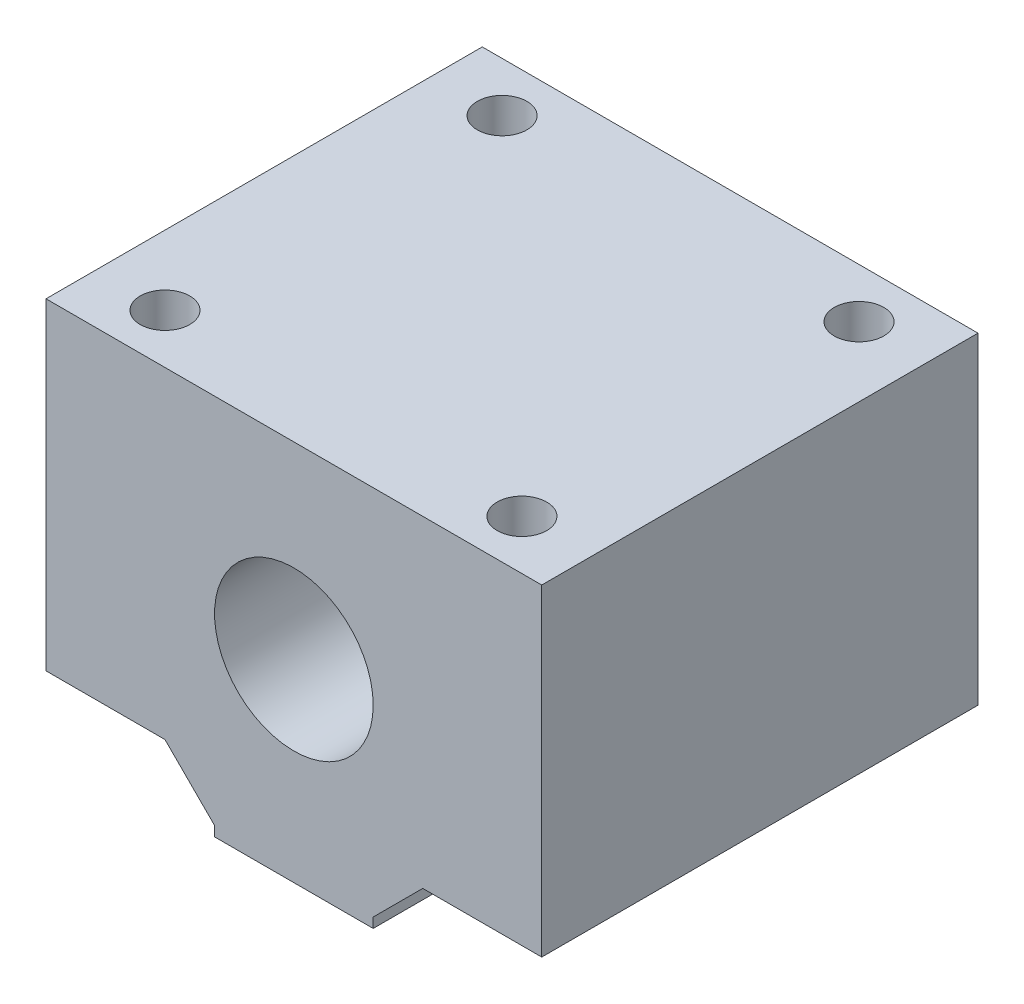
ISO-10303-21;
HEADER;
FILE_DESCRIPTION(('STEP AP214'),'2;1');
FILE_NAME('part.step','',(''),(''),'','','');
FILE_SCHEMA(('AUTOMOTIVE_DESIGN { 1 0 10303 214 1 1 1 1 }'));
ENDSEC;
DATA;
#1=APPLICATION_CONTEXT('core data for automotive mechanical design processes');
#2=APPLICATION_PROTOCOL_DEFINITION('international standard','automotive_design',2000,#1);
#3=PRODUCT_CONTEXT('',#1,'mechanical');
#4=PRODUCT('Part','Part','',(#3));
#5=PRODUCT_RELATED_PRODUCT_CATEGORY('part','',(#4));
#6=PRODUCT_DEFINITION_FORMATION('','',#4);
#7=PRODUCT_DEFINITION_CONTEXT('part definition',#1,'design');
#8=PRODUCT_DEFINITION('design','',#6,#7);
#9=PRODUCT_DEFINITION_SHAPE('','',#8);
#10=(LENGTH_UNIT() NAMED_UNIT(*) SI_UNIT(.MILLI.,.METRE.));
#11=(NAMED_UNIT(*) PLANE_ANGLE_UNIT() SI_UNIT($,.RADIAN.));
#12=(NAMED_UNIT(*) SI_UNIT($,.STERADIAN.) SOLID_ANGLE_UNIT());
#13=UNCERTAINTY_MEASURE_WITH_UNIT(LENGTH_MEASURE(1.E-05),#10,'distance_accuracy_value','');
#14=(GEOMETRIC_REPRESENTATION_CONTEXT(3) GLOBAL_UNCERTAINTY_ASSIGNED_CONTEXT((#13)) GLOBAL_UNIT_ASSIGNED_CONTEXT((#10,
#11,#12)) REPRESENTATION_CONTEXT('',''));
#15=CARTESIAN_POINT('',(0.,0.,0.));
#16=DIRECTION('',(0.,0.,1.));
#17=DIRECTION('',(1.,0.,0.));
#18=AXIS2_PLACEMENT_3D('',#15,#16,#17);
#19=CARTESIAN_POINT('',(-8.,5.99999999999999,44.));
#20=DIRECTION('',(0.,0.,1.));
#21=DIRECTION('',(1.,0.,0.));
#22=AXIS2_PLACEMENT_3D('',#19,#20,#21);
#23=PLANE('',#22);
#24=DIRECTION('',(0.,-1.,0.));
#25=VECTOR('',#24,1.);
#26=CARTESIAN_POINT('',(-8.,0.,44.));
#27=LINE('',#26,#25);
#28=CARTESIAN_POINT('',(-8.,0.999999999999986,44.));
#29=VERTEX_POINT('',#28);
#30=CARTESIAN_POINT('',(-8.,0.,44.));
#31=VERTEX_POINT('',#30);
#32=EDGE_CURVE('E163',#29,#31,#27,.T.);
#33=ORIENTED_EDGE('',*,*,#32,.T.);
#34=DIRECTION('',(1.,0.,0.));
#35=VECTOR('',#34,1.);
#36=CARTESIAN_POINT('',(8.,0.,44.));
#37=LINE('',#36,#35);
#38=CARTESIAN_POINT('',(8.,0.,44.));
#39=VERTEX_POINT('',#38);
#40=EDGE_CURVE('E101',#31,#39,#37,.T.);
#41=ORIENTED_EDGE('',*,*,#40,.T.);
#42=DIRECTION('',(0.,1.,0.));
#43=VECTOR('',#42,1.);
#44=CARTESIAN_POINT('',(8.,0.,44.));
#45=LINE('',#44,#43);
#46=CARTESIAN_POINT('',(8.,0.999999999999986,44.));
#47=VERTEX_POINT('',#46);
#48=EDGE_CURVE('E202',#39,#47,#45,.T.);
#49=ORIENTED_EDGE('',*,*,#48,.T.);
#50=DIRECTION('',(0.707106781186548,0.707106781186547,0.));
#51=VECTOR('',#50,1.);
#52=CARTESIAN_POINT('',(8.,0.999999999999986,44.));
#53=LINE('',#52,#51);
#54=CARTESIAN_POINT('',(13.,5.99999999999999,44.));
#55=VERTEX_POINT('',#54);
#56=EDGE_CURVE('E204',#47,#55,#53,.T.);
#57=ORIENTED_EDGE('',*,*,#56,.T.);
#58=DIRECTION('',(1.,0.,0.));
#59=VECTOR('',#58,1.);
#60=CARTESIAN_POINT('',(13.,5.99999999999999,44.));
#61=LINE('',#60,#59);
#62=CARTESIAN_POINT('',(25.,5.99999999999998,44.));
#63=VERTEX_POINT('',#62);
#64=EDGE_CURVE('E206',#55,#63,#61,.T.);
#65=ORIENTED_EDGE('',*,*,#64,.T.);
#66=DIRECTION('',(0.,1.,0.));
#67=VECTOR('',#66,1.);
#68=CARTESIAN_POINT('',(25.,5.99999999999998,44.));
#69=LINE('',#68,#67);
#70=CARTESIAN_POINT('',(25.,38.5,44.));
#71=VERTEX_POINT('',#70);
#72=EDGE_CURVE('E208',#63,#71,#69,.T.);
#73=ORIENTED_EDGE('',*,*,#72,.T.);
#74=DIRECTION('',(-1.,0.,0.));
#75=VECTOR('',#74,1.);
#76=CARTESIAN_POINT('',(-25.,38.5,44.));
#77=LINE('',#76,#75);
#78=CARTESIAN_POINT('',(-25.,38.5,44.));
#79=VERTEX_POINT('',#78);
#80=EDGE_CURVE('E126',#71,#79,#77,.T.);
#81=ORIENTED_EDGE('',*,*,#80,.T.);
#82=DIRECTION('',(0.,-1.,0.));
#83=VECTOR('',#82,1.);
#84=CARTESIAN_POINT('',(-25.,5.99999999999998,44.));
#85=LINE('',#84,#83);
#86=CARTESIAN_POINT('',(-25.,5.99999999999998,44.));
#87=VERTEX_POINT('',#86);
#88=EDGE_CURVE('E120',#79,#87,#85,.T.);
#89=ORIENTED_EDGE('',*,*,#88,.T.);
#90=DIRECTION('',(1.,0.,0.));
#91=VECTOR('',#90,1.);
#92=CARTESIAN_POINT('',(-13.,5.99999999999999,44.));
#93=LINE('',#92,#91);
#94=CARTESIAN_POINT('',(-13.,5.99999999999999,44.));
#95=VERTEX_POINT('',#94);
#96=EDGE_CURVE('E124',#87,#95,#93,.T.);
#97=ORIENTED_EDGE('',*,*,#96,.T.);
#98=DIRECTION('',(0.707106781186548,-0.707106781186547,0.));
#99=VECTOR('',#98,1.);
#100=CARTESIAN_POINT('',(-8.,0.999999999999986,44.));
#101=LINE('',#100,#99);
#102=EDGE_CURVE('E52',#95,#29,#101,.T.);
#103=ORIENTED_EDGE('',*,*,#102,.T.);
#104=EDGE_LOOP('',(#33,#41,#49,#57,#65,#73,#81,#89,#97,#103));
#105=FACE_BOUND('',#104,.T.);
#106=CARTESIAN_POINT('',(0.,19.5,44.));
#107=DIRECTION('',(0.,0.,1.));
#108=DIRECTION('',(1.,0.,0.));
#109=AXIS2_PLACEMENT_3D('',#106,#107,#108);
#110=CIRCLE('',#109,8.);
#111=CARTESIAN_POINT('',(8.,19.5,44.));
#112=VERTEX_POINT('',#111);
#113=EDGE_CURVE('E148',#112,#112,#110,.T.);
#114=ORIENTED_EDGE('',*,*,#113,.F.);
#115=EDGE_LOOP('',(#114));
#116=FACE_BOUND('',#115,.T.);
#117=ADVANCED_FACE('F33',(#105,#116),#23,.T.);
#118=CARTESIAN_POINT('',(-8.,5.99999999999999,0.));
#119=DIRECTION('',(0.,0.,1.));
#120=DIRECTION('',(1.,0.,0.));
#121=AXIS2_PLACEMENT_3D('',#118,#119,#120);
#122=PLANE('',#121);
#123=DIRECTION('',(0.,-1.,0.));
#124=VECTOR('',#123,1.);
#125=CARTESIAN_POINT('',(-8.,0.,0.));
#126=LINE('',#125,#124);
#127=CARTESIAN_POINT('',(-8.,0.999999999999986,0.));
#128=VERTEX_POINT('',#127);
#129=CARTESIAN_POINT('',(-8.,0.,0.));
#130=VERTEX_POINT('',#129);
#131=EDGE_CURVE('E144',#128,#130,#126,.T.);
#132=ORIENTED_EDGE('',*,*,#131,.F.);
#133=DIRECTION('',(0.707106781186548,-0.707106781186547,0.));
#134=VECTOR('',#133,1.);
#135=CARTESIAN_POINT('',(-8.,0.999999999999986,0.));
#136=LINE('',#135,#134);
#137=CARTESIAN_POINT('',(-13.,5.99999999999999,0.));
#138=VERTEX_POINT('',#137);
#139=EDGE_CURVE('E93',#138,#128,#136,.T.);
#140=ORIENTED_EDGE('',*,*,#139,.F.);
#141=DIRECTION('',(1.,0.,0.));
#142=VECTOR('',#141,1.);
#143=CARTESIAN_POINT('',(-13.,5.99999999999999,0.));
#144=LINE('',#143,#142);
#145=CARTESIAN_POINT('',(-25.,5.99999999999998,0.));
#146=VERTEX_POINT('',#145);
#147=EDGE_CURVE('E87',#146,#138,#144,.T.);
#148=ORIENTED_EDGE('',*,*,#147,.F.);
#149=DIRECTION('',(0.,-1.,0.));
#150=VECTOR('',#149,1.);
#151=CARTESIAN_POINT('',(-25.,5.99999999999998,0.));
#152=LINE('',#151,#150);
#153=CARTESIAN_POINT('',(-25.,38.5,0.));
#154=VERTEX_POINT('',#153);
#155=EDGE_CURVE('E134',#154,#146,#152,.T.);
#156=ORIENTED_EDGE('',*,*,#155,.F.);
#157=DIRECTION('',(-1.,0.,0.));
#158=VECTOR('',#157,1.);
#159=CARTESIAN_POINT('',(-25.,38.5,0.));
#160=LINE('',#159,#158);
#161=CARTESIAN_POINT('',(25.,38.5,0.));
#162=VERTEX_POINT('',#161);
#163=EDGE_CURVE('E158',#162,#154,#160,.T.);
#164=ORIENTED_EDGE('',*,*,#163,.F.);
#165=DIRECTION('',(0.,1.,0.));
#166=VECTOR('',#165,1.);
#167=CARTESIAN_POINT('',(25.,5.99999999999998,0.));
#168=LINE('',#167,#166);
#169=CARTESIAN_POINT('',(25.,5.99999999999998,0.));
#170=VERTEX_POINT('',#169);
#171=EDGE_CURVE('E156',#170,#162,#168,.T.);
#172=ORIENTED_EDGE('',*,*,#171,.F.);
#173=DIRECTION('',(1.,0.,0.));
#174=VECTOR('',#173,1.);
#175=CARTESIAN_POINT('',(13.,5.99999999999999,0.));
#176=LINE('',#175,#174);
#177=CARTESIAN_POINT('',(13.,5.99999999999999,0.));
#178=VERTEX_POINT('',#177);
#179=EDGE_CURVE('E154',#178,#170,#176,.T.);
#180=ORIENTED_EDGE('',*,*,#179,.F.);
#181=DIRECTION('',(0.707106781186548,0.707106781186547,0.));
#182=VECTOR('',#181,1.);
#183=CARTESIAN_POINT('',(8.,0.999999999999986,0.));
#184=LINE('',#183,#182);
#185=CARTESIAN_POINT('',(8.,0.999999999999986,0.));
#186=VERTEX_POINT('',#185);
#187=EDGE_CURVE('E152',#186,#178,#184,.T.);
#188=ORIENTED_EDGE('',*,*,#187,.F.);
#189=DIRECTION('',(0.,1.,0.));
#190=VECTOR('',#189,1.);
#191=CARTESIAN_POINT('',(8.,0.,0.));
#192=LINE('',#191,#190);
#193=CARTESIAN_POINT('',(8.,0.,0.));
#194=VERTEX_POINT('',#193);
#195=EDGE_CURVE('E150',#194,#186,#192,.T.);
#196=ORIENTED_EDGE('',*,*,#195,.F.);
#197=DIRECTION('',(1.,0.,0.));
#198=VECTOR('',#197,1.);
#199=CARTESIAN_POINT('',(8.,0.,0.));
#200=LINE('',#199,#198);
#201=EDGE_CURVE('E147',#130,#194,#200,.T.);
#202=ORIENTED_EDGE('',*,*,#201,.F.);
#203=EDGE_LOOP('',(#132,#140,#148,#156,#164,#172,#180,#188,#196,#202));
#204=FACE_BOUND('',#203,.T.);
#205=CARTESIAN_POINT('',(0.,19.5,0.));
#206=DIRECTION('',(0.,0.,1.));
#207=DIRECTION('',(1.,0.,0.));
#208=AXIS2_PLACEMENT_3D('',#205,#206,#207);
#209=CIRCLE('',#208,8.);
#210=CARTESIAN_POINT('',(8.,19.5,0.));
#211=VERTEX_POINT('',#210);
#212=EDGE_CURVE('E182',#211,#211,#209,.T.);
#213=ORIENTED_EDGE('',*,*,#212,.T.);
#214=EDGE_LOOP('',(#213));
#215=FACE_BOUND('',#214,.T.);
#216=ADVANCED_FACE('F221',(#204,#215),#122,.F.);
#217=CARTESIAN_POINT('',(-8.,0.,44.));
#218=DIRECTION('',(1.,0.,0.));
#219=DIRECTION('',(0.,0.,-1.));
#220=AXIS2_PLACEMENT_3D('',#217,#218,#219);
#221=PLANE('',#220);
#222=ORIENTED_EDGE('',*,*,#131,.T.);
#223=DIRECTION('',(0.,0.,-1.));
#224=VECTOR('',#223,1.);
#225=CARTESIAN_POINT('',(-8.,0.,44.));
#226=LINE('',#225,#224);
#227=EDGE_CURVE('E11',#31,#130,#226,.T.);
#228=ORIENTED_EDGE('',*,*,#227,.F.);
#229=ORIENTED_EDGE('',*,*,#32,.F.);
#230=DIRECTION('',(0.,0.,-1.));
#231=VECTOR('',#230,1.);
#232=CARTESIAN_POINT('',(-8.,0.999999999999986,44.));
#233=LINE('',#232,#231);
#234=EDGE_CURVE('E140',#29,#128,#233,.T.);
#235=ORIENTED_EDGE('',*,*,#234,.T.);
#236=EDGE_LOOP('',(#222,#228,#229,#235));
#237=FACE_BOUND('',#236,.T.);
#238=ADVANCED_FACE('F35',(#237),#221,.F.);
#239=CARTESIAN_POINT('',(8.,0.,44.));
#240=DIRECTION('',(0.,1.,0.));
#241=DIRECTION('',(0.,0.,1.));
#242=AXIS2_PLACEMENT_3D('',#239,#240,#241);
#243=PLANE('',#242);
#244=ORIENTED_EDGE('',*,*,#201,.T.);
#245=DIRECTION('',(0.,0.,-1.));
#246=VECTOR('',#245,1.);
#247=CARTESIAN_POINT('',(8.,0.,44.));
#248=LINE('',#247,#246);
#249=EDGE_CURVE('E43',#39,#194,#248,.T.);
#250=ORIENTED_EDGE('',*,*,#249,.F.);
#251=ORIENTED_EDGE('',*,*,#40,.F.);
#252=ORIENTED_EDGE('',*,*,#227,.T.);
#253=EDGE_LOOP('',(#244,#250,#251,#252));
#254=FACE_BOUND('',#253,.T.);
#255=ADVANCED_FACE('F301',(#254),#243,.F.);
#256=CARTESIAN_POINT('',(8.,0.,44.));
#257=DIRECTION('',(-1.,0.,0.));
#258=DIRECTION('',(0.,0.,1.));
#259=AXIS2_PLACEMENT_3D('',#256,#257,#258);
#260=PLANE('',#259);
#261=ORIENTED_EDGE('',*,*,#195,.T.);
#262=DIRECTION('',(0.,0.,-1.));
#263=VECTOR('',#262,1.);
#264=CARTESIAN_POINT('',(8.,0.999999999999986,44.));
#265=LINE('',#264,#263);
#266=EDGE_CURVE('E176',#47,#186,#265,.T.);
#267=ORIENTED_EDGE('',*,*,#266,.F.);
#268=ORIENTED_EDGE('',*,*,#48,.F.);
#269=ORIENTED_EDGE('',*,*,#249,.T.);
#270=EDGE_LOOP('',(#261,#267,#268,#269));
#271=FACE_BOUND('',#270,.T.);
#272=ADVANCED_FACE('F298',(#271),#260,.F.);
#273=CARTESIAN_POINT('',(8.,0.999999999999986,44.));
#274=DIRECTION('',(-0.707106781186547,0.707106781186548,0.));
#275=DIRECTION('',(-0.707106781186548,-0.707106781186547,0.));
#276=AXIS2_PLACEMENT_3D('',#273,#274,#275);
#277=PLANE('',#276);
#278=ORIENTED_EDGE('',*,*,#187,.T.);
#279=DIRECTION('',(0.,0.,-1.));
#280=VECTOR('',#279,1.);
#281=CARTESIAN_POINT('',(13.,5.99999999999999,44.));
#282=LINE('',#281,#280);
#283=EDGE_CURVE('E173',#55,#178,#282,.T.);
#284=ORIENTED_EDGE('',*,*,#283,.F.);
#285=ORIENTED_EDGE('',*,*,#56,.F.);
#286=ORIENTED_EDGE('',*,*,#266,.T.);
#287=EDGE_LOOP('',(#278,#284,#285,#286));
#288=FACE_BOUND('',#287,.T.);
#289=ADVANCED_FACE('F294',(#288),#277,.F.);
#290=CARTESIAN_POINT('',(13.,5.99999999999999,44.));
#291=DIRECTION('',(0.,1.,0.));
#292=DIRECTION('',(-1.,0.,0.));
#293=AXIS2_PLACEMENT_3D('',#290,#291,#292);
#294=PLANE('',#293);
#295=CARTESIAN_POINT('',(18.,5.99999999999999,39.));
#296=DIRECTION('',(0.,1.,0.));
#297=DIRECTION('',(-1.,0.,0.));
#298=AXIS2_PLACEMENT_3D('',#295,#296,#297);
#299=CIRCLE('',#298,2.5);
#300=CARTESIAN_POINT('',(18.,5.99999999999999,41.5));
#301=VERTEX_POINT('',#300);
#302=EDGE_CURVE('E270',#301,#301,#299,.T.);
#303=ORIENTED_EDGE('',*,*,#302,.T.);
#304=EDGE_LOOP('',(#303));
#305=FACE_BOUND('',#304,.T.);
#306=CARTESIAN_POINT('',(18.,5.99999999999999,5.));
#307=DIRECTION('',(0.,1.,0.));
#308=DIRECTION('',(-1.,0.,0.));
#309=AXIS2_PLACEMENT_3D('',#306,#307,#308);
#310=CIRCLE('',#309,2.5);
#311=CARTESIAN_POINT('',(18.,5.99999999999999,7.49999999999999));
#312=VERTEX_POINT('',#311);
#313=EDGE_CURVE('E189',#312,#312,#310,.T.);
#314=ORIENTED_EDGE('',*,*,#313,.T.);
#315=EDGE_LOOP('',(#314));
#316=FACE_BOUND('',#315,.T.);
#317=ORIENTED_EDGE('',*,*,#179,.T.);
#318=DIRECTION('',(0.,0.,-1.));
#319=VECTOR('',#318,1.);
#320=CARTESIAN_POINT('',(25.,5.99999999999998,44.));
#321=LINE('',#320,#319);
#322=EDGE_CURVE('E170',#63,#170,#321,.T.);
#323=ORIENTED_EDGE('',*,*,#322,.F.);
#324=ORIENTED_EDGE('',*,*,#64,.F.);
#325=ORIENTED_EDGE('',*,*,#283,.T.);
#326=EDGE_LOOP('',(#317,#323,#324,#325));
#327=FACE_BOUND('',#326,.T.);
#328=ADVANCED_FACE('F288',(#305,#316,#327),#294,.F.);
#329=CARTESIAN_POINT('',(25.,5.99999999999998,44.));
#330=DIRECTION('',(-1.,0.,0.));
#331=DIRECTION('',(0.,0.,1.));
#332=AXIS2_PLACEMENT_3D('',#329,#330,#331);
#333=PLANE('',#332);
#334=ORIENTED_EDGE('',*,*,#171,.T.);
#335=DIRECTION('',(0.,0.,-1.));
#336=VECTOR('',#335,1.);
#337=CARTESIAN_POINT('',(25.,38.5,44.));
#338=LINE('',#337,#336);
#339=EDGE_CURVE('E167',#71,#162,#338,.T.);
#340=ORIENTED_EDGE('',*,*,#339,.F.);
#341=ORIENTED_EDGE('',*,*,#72,.F.);
#342=ORIENTED_EDGE('',*,*,#322,.T.);
#343=EDGE_LOOP('',(#334,#340,#341,#342));
#344=FACE_BOUND('',#343,.T.);
#345=ADVANCED_FACE('F214',(#344),#333,.F.);
#346=CARTESIAN_POINT('',(-25.,38.5,44.));
#347=DIRECTION('',(0.,-1.,0.));
#348=DIRECTION('',(0.,0.,-1.));
#349=AXIS2_PLACEMENT_3D('',#346,#347,#348);
#350=PLANE('',#349);
#351=CARTESIAN_POINT('',(-18.,38.5,39.));
#352=DIRECTION('',(0.,1.,0.));
#353=DIRECTION('',(0.,0.,-1.));
#354=AXIS2_PLACEMENT_3D('',#351,#352,#353);
#355=CIRCLE('',#354,2.5);
#356=CARTESIAN_POINT('',(-18.,38.5,41.5));
#357=VERTEX_POINT('',#356);
#358=EDGE_CURVE('E265',#357,#357,#355,.T.);
#359=ORIENTED_EDGE('',*,*,#358,.F.);
#360=EDGE_LOOP('',(#359));
#361=FACE_BOUND('',#360,.T.);
#362=CARTESIAN_POINT('',(18.,38.5,39.));
#363=DIRECTION('',(0.,1.,0.));
#364=DIRECTION('',(0.,0.,1.));
#365=AXIS2_PLACEMENT_3D('',#362,#363,#364);
#366=CIRCLE('',#365,2.5);
#367=CARTESIAN_POINT('',(18.,38.5,41.5));
#368=VERTEX_POINT('',#367);
#369=EDGE_CURVE('E268',#368,#368,#366,.T.);
#370=ORIENTED_EDGE('',*,*,#369,.F.);
#371=EDGE_LOOP('',(#370));
#372=FACE_BOUND('',#371,.T.);
#373=CARTESIAN_POINT('',(18.,38.5,5.));
#374=DIRECTION('',(0.,1.,0.));
#375=DIRECTION('',(0.,0.,-1.));
#376=AXIS2_PLACEMENT_3D('',#373,#374,#375);
#377=CIRCLE('',#376,2.5);
#378=CARTESIAN_POINT('',(18.,38.5,7.49999999999999));
#379=VERTEX_POINT('',#378);
#380=EDGE_CURVE('E194',#379,#379,#377,.T.);
#381=ORIENTED_EDGE('',*,*,#380,.F.);
#382=EDGE_LOOP('',(#381));
#383=FACE_BOUND('',#382,.T.);
#384=CARTESIAN_POINT('',(-18.,38.5,5.));
#385=DIRECTION('',(0.,1.,0.));
#386=DIRECTION('',(0.,0.,1.));
#387=AXIS2_PLACEMENT_3D('',#384,#385,#386);
#388=CIRCLE('',#387,2.5);
#389=CARTESIAN_POINT('',(-18.,38.5,7.5));
#390=VERTEX_POINT('',#389);
#391=EDGE_CURVE('E183',#390,#390,#388,.T.);
#392=ORIENTED_EDGE('',*,*,#391,.F.);
#393=EDGE_LOOP('',(#392));
#394=FACE_BOUND('',#393,.T.);
#395=ORIENTED_EDGE('',*,*,#163,.T.);
#396=DIRECTION('',(0.,0.,-1.));
#397=VECTOR('',#396,1.);
#398=CARTESIAN_POINT('',(-25.,38.5,44.));
#399=LINE('',#398,#397);
#400=EDGE_CURVE('E135',#79,#154,#399,.T.);
#401=ORIENTED_EDGE('',*,*,#400,.F.);
#402=ORIENTED_EDGE('',*,*,#80,.F.);
#403=ORIENTED_EDGE('',*,*,#339,.T.);
#404=EDGE_LOOP('',(#395,#401,#402,#403));
#405=FACE_BOUND('',#404,.T.);
#406=ADVANCED_FACE('F218',(#361,#372,#383,#394,#405),#350,.F.);
#407=CARTESIAN_POINT('',(-25.,5.99999999999998,44.));
#408=DIRECTION('',(1.,0.,0.));
#409=DIRECTION('',(0.,0.,-1.));
#410=AXIS2_PLACEMENT_3D('',#407,#408,#409);
#411=PLANE('',#410);
#412=ORIENTED_EDGE('',*,*,#155,.T.);
#413=DIRECTION('',(0.,0.,-1.));
#414=VECTOR('',#413,1.);
#415=CARTESIAN_POINT('',(-25.,5.99999999999998,44.));
#416=LINE('',#415,#414);
#417=EDGE_CURVE('E131',#87,#146,#416,.T.);
#418=ORIENTED_EDGE('',*,*,#417,.F.);
#419=ORIENTED_EDGE('',*,*,#88,.F.);
#420=ORIENTED_EDGE('',*,*,#400,.T.);
#421=EDGE_LOOP('',(#412,#418,#419,#420));
#422=FACE_BOUND('',#421,.T.);
#423=ADVANCED_FACE('F132',(#422),#411,.F.);
#424=CARTESIAN_POINT('',(-13.,5.99999999999999,44.));
#425=DIRECTION('',(0.,1.,0.));
#426=DIRECTION('',(-1.,0.,0.));
#427=AXIS2_PLACEMENT_3D('',#424,#425,#426);
#428=PLANE('',#427);
#429=CARTESIAN_POINT('',(-18.,5.99999999999999,39.));
#430=DIRECTION('',(0.,1.,0.));
#431=DIRECTION('',(-1.,0.,0.));
#432=AXIS2_PLACEMENT_3D('',#429,#430,#431);
#433=CIRCLE('',#432,2.5);
#434=CARTESIAN_POINT('',(-18.,5.99999999999999,41.5));
#435=VERTEX_POINT('',#434);
#436=EDGE_CURVE('E37',#435,#435,#433,.T.);
#437=ORIENTED_EDGE('',*,*,#436,.T.);
#438=EDGE_LOOP('',(#437));
#439=FACE_BOUND('',#438,.T.);
#440=CARTESIAN_POINT('',(-18.,5.99999999999999,5.));
#441=DIRECTION('',(0.,1.,0.));
#442=DIRECTION('',(-1.,0.,0.));
#443=AXIS2_PLACEMENT_3D('',#440,#441,#442);
#444=CIRCLE('',#443,2.5);
#445=CARTESIAN_POINT('',(-18.,5.99999999999999,7.5));
#446=VERTEX_POINT('',#445);
#447=EDGE_CURVE('E180',#446,#446,#444,.T.);
#448=ORIENTED_EDGE('',*,*,#447,.T.);
#449=EDGE_LOOP('',(#448));
#450=FACE_BOUND('',#449,.T.);
#451=ORIENTED_EDGE('',*,*,#147,.T.);
#452=DIRECTION('',(0.,0.,-1.));
#453=VECTOR('',#452,1.);
#454=CARTESIAN_POINT('',(-13.,5.99999999999999,44.));
#455=LINE('',#454,#453);
#456=EDGE_CURVE('E136',#95,#138,#455,.T.);
#457=ORIENTED_EDGE('',*,*,#456,.F.);
#458=ORIENTED_EDGE('',*,*,#96,.F.);
#459=ORIENTED_EDGE('',*,*,#417,.T.);
#460=EDGE_LOOP('',(#451,#457,#458,#459));
#461=FACE_BOUND('',#460,.T.);
#462=ADVANCED_FACE('F138',(#439,#450,#461),#428,.F.);
#463=CARTESIAN_POINT('',(-8.,0.999999999999986,44.));
#464=DIRECTION('',(0.707106781186547,0.707106781186548,0.));
#465=DIRECTION('',(-0.707106781186548,0.707106781186547,0.));
#466=AXIS2_PLACEMENT_3D('',#463,#464,#465);
#467=PLANE('',#466);
#468=ORIENTED_EDGE('',*,*,#139,.T.);
#469=ORIENTED_EDGE('',*,*,#234,.F.);
#470=ORIENTED_EDGE('',*,*,#102,.F.);
#471=ORIENTED_EDGE('',*,*,#456,.T.);
#472=EDGE_LOOP('',(#468,#469,#470,#471));
#473=FACE_BOUND('',#472,.T.);
#474=ADVANCED_FACE('F227',(#473),#467,.F.);
#475=CARTESIAN_POINT('',(0.,19.5,44.));
#476=DIRECTION('',(0.,0.,-1.));
#477=DIRECTION('',(-1.,0.,0.));
#478=AXIS2_PLACEMENT_3D('',#475,#476,#477);
#479=CYLINDRICAL_SURFACE('',#478,8.);
#480=ORIENTED_EDGE('',*,*,#113,.T.);
#481=EDGE_LOOP('',(#480));
#482=FACE_BOUND('',#481,.T.);
#483=ORIENTED_EDGE('',*,*,#212,.F.);
#484=EDGE_LOOP('',(#483));
#485=FACE_BOUND('',#484,.T.);
#486=ADVANCED_FACE('F229',(#482,#485),#479,.F.);
#487=CARTESIAN_POINT('',(-18.,0.,5.));
#488=DIRECTION('',(0.,1.,0.));
#489=DIRECTION('',(0.,0.,1.));
#490=AXIS2_PLACEMENT_3D('',#487,#488,#489);
#491=CYLINDRICAL_SURFACE('',#490,2.5);
#492=CARTESIAN_POINT('',(-18.,38.5,7.5));
#493=CARTESIAN_POINT('',(-18.,38.1614583333333,7.5));
#494=CARTESIAN_POINT('',(-18.,37.8229166666666,7.5));
#495=CARTESIAN_POINT('',(-18.,37.1458333333333,7.5));
#496=CARTESIAN_POINT('',(-18.,36.8072916666666,7.5));
#497=CARTESIAN_POINT('',(-18.,36.1302083333333,7.5));
#498=CARTESIAN_POINT('',(-18.,35.7916666666666,7.5));
#499=CARTESIAN_POINT('',(-18.,35.1145833333333,7.5));
#500=CARTESIAN_POINT('',(-18.,34.7760416666666,7.5));
#501=CARTESIAN_POINT('',(-18.,34.0989583333333,7.5));
#502=CARTESIAN_POINT('',(-18.,33.7604166666667,7.5));
#503=CARTESIAN_POINT('',(-18.,33.0833333333333,7.5));
#504=CARTESIAN_POINT('',(-18.,32.7447916666666,7.5));
#505=CARTESIAN_POINT('',(-18.,32.0677083333333,7.5));
#506=CARTESIAN_POINT('',(-18.,31.7291666666666,7.5));
#507=CARTESIAN_POINT('',(-18.,31.0520833333333,7.5));
#508=CARTESIAN_POINT('',(-18.,30.7135416666666,7.5));
#509=CARTESIAN_POINT('',(-18.,30.0364583333333,7.5));
#510=CARTESIAN_POINT('',(-18.,29.6979166666667,7.5));
#511=CARTESIAN_POINT('',(-18.,29.0208333333333,7.5));
#512=CARTESIAN_POINT('',(-18.,28.6822916666667,7.5));
#513=CARTESIAN_POINT('',(-18.,28.0052083333333,7.5));
#514=CARTESIAN_POINT('',(-18.,27.6666666666667,7.5));
#515=CARTESIAN_POINT('',(-18.,26.9895833333333,7.5));
#516=CARTESIAN_POINT('',(-18.,26.6510416666667,7.5));
#517=CARTESIAN_POINT('',(-18.,25.9739583333333,7.5));
#518=CARTESIAN_POINT('',(-18.,25.6354166666667,7.5));
#519=CARTESIAN_POINT('',(-18.,24.9583333333333,7.5));
#520=CARTESIAN_POINT('',(-18.,24.6197916666666,7.5));
#521=CARTESIAN_POINT('',(-18.,23.9427083333333,7.5));
#522=CARTESIAN_POINT('',(-18.,23.6041666666667,7.5));
#523=CARTESIAN_POINT('',(-18.,22.9270833333333,7.5));
#524=CARTESIAN_POINT('',(-18.,22.5885416666667,7.5));
#525=CARTESIAN_POINT('',(-18.,21.9114583333333,7.5));
#526=CARTESIAN_POINT('',(-18.,21.5729166666667,7.5));
#527=CARTESIAN_POINT('',(-18.,20.8958333333333,7.5));
#528=CARTESIAN_POINT('',(-18.,20.5572916666667,7.5));
#529=CARTESIAN_POINT('',(-18.,19.8802083333333,7.5));
#530=CARTESIAN_POINT('',(-18.,19.5416666666666,7.5));
#531=CARTESIAN_POINT('',(-18.,18.8645833333333,7.5));
#532=CARTESIAN_POINT('',(-18.,18.5260416666667,7.5));
#533=CARTESIAN_POINT('',(-18.,17.8489583333333,7.5));
#534=CARTESIAN_POINT('',(-18.,17.5104166666667,7.5));
#535=CARTESIAN_POINT('',(-18.,16.8333333333333,7.5));
#536=CARTESIAN_POINT('',(-18.,16.4947916666666,7.5));
#537=CARTESIAN_POINT('',(-18.,15.8177083333333,7.5));
#538=CARTESIAN_POINT('',(-18.,15.4791666666666,7.5));
#539=CARTESIAN_POINT('',(-18.,14.8020833333333,7.5));
#540=CARTESIAN_POINT('',(-18.,14.4635416666666,7.5));
#541=CARTESIAN_POINT('',(-18.,13.7864583333333,7.5));
#542=CARTESIAN_POINT('',(-18.,13.4479166666667,7.5));
#543=CARTESIAN_POINT('',(-18.,12.7708333333333,7.5));
#544=CARTESIAN_POINT('',(-18.,12.4322916666667,7.5));
#545=CARTESIAN_POINT('',(-18.,11.7552083333333,7.5));
#546=CARTESIAN_POINT('',(-18.,11.4166666666667,7.5));
#547=CARTESIAN_POINT('',(-18.,10.7395833333333,7.5));
#548=CARTESIAN_POINT('',(-18.,10.4010416666666,7.5));
#549=CARTESIAN_POINT('',(-18.,9.72395833333332,7.5));
#550=CARTESIAN_POINT('',(-18.,9.38541666666665,7.5));
#551=CARTESIAN_POINT('',(-18.,8.70833333333332,7.5));
#552=CARTESIAN_POINT('',(-18.,8.36979166666665,7.5));
#553=CARTESIAN_POINT('',(-18.,7.69270833333332,7.5));
#554=CARTESIAN_POINT('',(-18.,7.35416666666665,7.5));
#555=CARTESIAN_POINT('',(-18.,6.67708333333332,7.5));
#556=CARTESIAN_POINT('',(-18.,6.33854166666665,7.5));
#557=CARTESIAN_POINT('',(-18.,5.99999999999998,7.5));
#558=B_SPLINE_CURVE_WITH_KNOTS('',3,(#492,#493,#494,#495,#496,#497,#498,#499,#500,#501,#502,
#503,#504,#505,#506,#507,#508,#509,#510,#511,#512,#513,#514,#515,#516,#517,#518,#519,#520,#521,
#522,#523,#524,#525,#526,#527,#528,#529,#530,#531,#532,#533,#534,#535,#536,#537,#538,#539,#540,
#541,#542,#543,#544,#545,#546,#547,#548,#549,#550,#551,#552,#553,#554,#555,#556,#557),
.UNSPECIFIED.,.F.,.F.,(4,2,2,2,2,2,2,2,2,2,2,2,2,2,2,2,2,2,2,2,2,2,2,2,2,2,2,2,2,2,2,2,4),(0.,
1.015625,2.03125,3.046875,4.0625,5.078125,6.09375,7.109375,8.125,9.140625,10.15625,11.171875,
12.1875,13.203125,14.21875,15.234375,16.25,17.265625,18.28125,19.296875,20.3125,21.328125,
22.34375,23.359375,24.375,25.390625,26.40625,27.421875,28.4375,29.453125,30.46875,31.484375,
32.5),.UNSPECIFIED.);
#559=EDGE_CURVE('BSEAM235',#390,#446,#558,.T.);
#560=ORIENTED_EDGE('',*,*,#391,.T.);
#561=ORIENTED_EDGE('',*,*,#447,.F.);
#562=ORIENTED_EDGE('',*,*,#559,.T.);
#563=ORIENTED_EDGE('',*,*,#559,.F.);
#564=EDGE_LOOP('',(#560,#562,#561,#563));
#565=FACE_BOUND('',#564,.T.);
#566=ADVANCED_FACE('F235',(#565),#491,.F.);
#567=CARTESIAN_POINT('',(18.,0.,5.));
#568=DIRECTION('',(0.,1.,0.));
#569=DIRECTION('',(0.,0.,1.));
#570=AXIS2_PLACEMENT_3D('',#567,#568,#569);
#571=CYLINDRICAL_SURFACE('',#570,2.5);
#572=CARTESIAN_POINT('',(18.,38.5,7.49999999999999));
#573=CARTESIAN_POINT('',(18.,38.1614583333333,7.49999999999999));
#574=CARTESIAN_POINT('',(18.,37.8229166666666,7.49999999999999));
#575=CARTESIAN_POINT('',(18.,37.1458333333333,7.49999999999999));
#576=CARTESIAN_POINT('',(18.,36.8072916666666,7.49999999999999));
#577=CARTESIAN_POINT('',(18.,36.1302083333333,7.49999999999999));
#578=CARTESIAN_POINT('',(18.,35.7916666666666,7.49999999999999));
#579=CARTESIAN_POINT('',(18.,35.1145833333333,7.49999999999999));
#580=CARTESIAN_POINT('',(18.,34.7760416666666,7.49999999999999));
#581=CARTESIAN_POINT('',(18.,34.0989583333333,7.49999999999999));
#582=CARTESIAN_POINT('',(18.,33.7604166666667,7.49999999999999));
#583=CARTESIAN_POINT('',(18.,33.0833333333333,7.49999999999999));
#584=CARTESIAN_POINT('',(18.,32.7447916666666,7.49999999999999));
#585=CARTESIAN_POINT('',(18.,32.0677083333333,7.49999999999999));
#586=CARTESIAN_POINT('',(18.,31.7291666666666,7.49999999999999));
#587=CARTESIAN_POINT('',(18.,31.0520833333333,7.49999999999999));
#588=CARTESIAN_POINT('',(18.,30.7135416666666,7.49999999999999));
#589=CARTESIAN_POINT('',(18.,30.0364583333333,7.49999999999999));
#590=CARTESIAN_POINT('',(18.,29.6979166666667,7.49999999999999));
#591=CARTESIAN_POINT('',(18.,29.0208333333333,7.49999999999999));
#592=CARTESIAN_POINT('',(18.,28.6822916666667,7.49999999999999));
#593=CARTESIAN_POINT('',(18.,28.0052083333333,7.49999999999999));
#594=CARTESIAN_POINT('',(18.,27.6666666666667,7.49999999999999));
#595=CARTESIAN_POINT('',(18.,26.9895833333333,7.49999999999999));
#596=CARTESIAN_POINT('',(18.,26.6510416666667,7.49999999999999));
#597=CARTESIAN_POINT('',(18.,25.9739583333333,7.49999999999999));
#598=CARTESIAN_POINT('',(18.,25.6354166666667,7.49999999999999));
#599=CARTESIAN_POINT('',(18.,24.9583333333333,7.49999999999999));
#600=CARTESIAN_POINT('',(18.,24.6197916666666,7.49999999999999));
#601=CARTESIAN_POINT('',(18.,23.9427083333333,7.49999999999999));
#602=CARTESIAN_POINT('',(18.,23.6041666666667,7.49999999999999));
#603=CARTESIAN_POINT('',(18.,22.9270833333333,7.49999999999999));
#604=CARTESIAN_POINT('',(18.,22.5885416666667,7.49999999999999));
#605=CARTESIAN_POINT('',(18.,21.9114583333333,7.49999999999999));
#606=CARTESIAN_POINT('',(18.,21.5729166666667,7.49999999999999));
#607=CARTESIAN_POINT('',(18.,20.8958333333333,7.49999999999999));
#608=CARTESIAN_POINT('',(18.,20.5572916666667,7.49999999999999));
#609=CARTESIAN_POINT('',(18.,19.8802083333333,7.49999999999999));
#610=CARTESIAN_POINT('',(18.,19.5416666666666,7.49999999999999));
#611=CARTESIAN_POINT('',(18.,18.8645833333333,7.49999999999999));
#612=CARTESIAN_POINT('',(18.,18.5260416666667,7.49999999999999));
#613=CARTESIAN_POINT('',(18.,17.8489583333333,7.49999999999999));
#614=CARTESIAN_POINT('',(18.,17.5104166666667,7.49999999999999));
#615=CARTESIAN_POINT('',(18.,16.8333333333333,7.49999999999999));
#616=CARTESIAN_POINT('',(18.,16.4947916666666,7.49999999999999));
#617=CARTESIAN_POINT('',(18.,15.8177083333333,7.49999999999999));
#618=CARTESIAN_POINT('',(18.,15.4791666666666,7.49999999999999));
#619=CARTESIAN_POINT('',(18.,14.8020833333333,7.49999999999999));
#620=CARTESIAN_POINT('',(18.,14.4635416666666,7.49999999999999));
#621=CARTESIAN_POINT('',(18.,13.7864583333333,7.49999999999999));
#622=CARTESIAN_POINT('',(18.,13.4479166666667,7.49999999999999));
#623=CARTESIAN_POINT('',(18.,12.7708333333333,7.49999999999999));
#624=CARTESIAN_POINT('',(18.,12.4322916666667,7.49999999999999));
#625=CARTESIAN_POINT('',(18.,11.7552083333333,7.49999999999999));
#626=CARTESIAN_POINT('',(18.,11.4166666666667,7.49999999999999));
#627=CARTESIAN_POINT('',(18.,10.7395833333333,7.49999999999999));
#628=CARTESIAN_POINT('',(18.,10.4010416666666,7.49999999999999));
#629=CARTESIAN_POINT('',(18.,9.72395833333332,7.49999999999999));
#630=CARTESIAN_POINT('',(18.,9.38541666666665,7.49999999999999));
#631=CARTESIAN_POINT('',(18.,8.70833333333332,7.49999999999999));
#632=CARTESIAN_POINT('',(18.,8.36979166666665,7.49999999999999));
#633=CARTESIAN_POINT('',(18.,7.69270833333332,7.49999999999999));
#634=CARTESIAN_POINT('',(18.,7.35416666666665,7.49999999999999));
#635=CARTESIAN_POINT('',(18.,6.67708333333332,7.49999999999999));
#636=CARTESIAN_POINT('',(18.,6.33854166666665,7.49999999999999));
#637=CARTESIAN_POINT('',(18.,5.99999999999998,7.49999999999999));
#638=B_SPLINE_CURVE_WITH_KNOTS('',3,(#572,#573,#574,#575,#576,#577,#578,#579,#580,#581,#582,
#583,#584,#585,#586,#587,#588,#589,#590,#591,#592,#593,#594,#595,#596,#597,#598,#599,#600,#601,
#602,#603,#604,#605,#606,#607,#608,#609,#610,#611,#612,#613,#614,#615,#616,#617,#618,#619,#620,
#621,#622,#623,#624,#625,#626,#627,#628,#629,#630,#631,#632,#633,#634,#635,#636,#637),
.UNSPECIFIED.,.F.,.F.,(4,2,2,2,2,2,2,2,2,2,2,2,2,2,2,2,2,2,2,2,2,2,2,2,2,2,2,2,2,2,2,2,4),(0.,
1.015625,2.03125,3.046875,4.0625,5.078125,6.09375,7.109375,8.125,9.140625,10.15625,11.171875,
12.1875,13.203125,14.21875,15.234375,16.25,17.265625,18.28125,19.296875,20.3125,21.328125,
22.34375,23.359375,24.375,25.390625,26.40625,27.421875,28.4375,29.453125,30.46875,31.484375,
32.5),.UNSPECIFIED.);
#639=EDGE_CURVE('BSEAM249',#379,#312,#638,.T.);
#640=ORIENTED_EDGE('',*,*,#380,.T.);
#641=ORIENTED_EDGE('',*,*,#313,.F.);
#642=ORIENTED_EDGE('',*,*,#639,.T.);
#643=ORIENTED_EDGE('',*,*,#639,.F.);
#644=EDGE_LOOP('',(#640,#642,#641,#643));
#645=FACE_BOUND('',#644,.T.);
#646=ADVANCED_FACE('F249',(#645),#571,.F.);
#647=CARTESIAN_POINT('',(18.,0.,39.));
#648=DIRECTION('',(0.,1.,0.));
#649=DIRECTION('',(0.,0.,1.));
#650=AXIS2_PLACEMENT_3D('',#647,#648,#649);
#651=CYLINDRICAL_SURFACE('',#650,2.5);
#652=CARTESIAN_POINT('',(18.,38.5,41.5));
#653=CARTESIAN_POINT('',(18.,38.1614583333333,41.5));
#654=CARTESIAN_POINT('',(18.,37.8229166666666,41.5));
#655=CARTESIAN_POINT('',(18.,37.1458333333333,41.5));
#656=CARTESIAN_POINT('',(18.,36.8072916666666,41.5));
#657=CARTESIAN_POINT('',(18.,36.1302083333333,41.5));
#658=CARTESIAN_POINT('',(18.,35.7916666666666,41.5));
#659=CARTESIAN_POINT('',(18.,35.1145833333333,41.5));
#660=CARTESIAN_POINT('',(18.,34.7760416666666,41.5));
#661=CARTESIAN_POINT('',(18.,34.0989583333333,41.5));
#662=CARTESIAN_POINT('',(18.,33.7604166666667,41.5));
#663=CARTESIAN_POINT('',(18.,33.0833333333333,41.5));
#664=CARTESIAN_POINT('',(18.,32.7447916666666,41.5));
#665=CARTESIAN_POINT('',(18.,32.0677083333333,41.5));
#666=CARTESIAN_POINT('',(18.,31.7291666666666,41.5));
#667=CARTESIAN_POINT('',(18.,31.0520833333333,41.5));
#668=CARTESIAN_POINT('',(18.,30.7135416666666,41.5));
#669=CARTESIAN_POINT('',(18.,30.0364583333333,41.5));
#670=CARTESIAN_POINT('',(18.,29.6979166666667,41.5));
#671=CARTESIAN_POINT('',(18.,29.0208333333333,41.5));
#672=CARTESIAN_POINT('',(18.,28.6822916666667,41.5));
#673=CARTESIAN_POINT('',(18.,28.0052083333333,41.5));
#674=CARTESIAN_POINT('',(18.,27.6666666666667,41.5));
#675=CARTESIAN_POINT('',(18.,26.9895833333333,41.5));
#676=CARTESIAN_POINT('',(18.,26.6510416666667,41.5));
#677=CARTESIAN_POINT('',(18.,25.9739583333333,41.5));
#678=CARTESIAN_POINT('',(18.,25.6354166666667,41.5));
#679=CARTESIAN_POINT('',(18.,24.9583333333333,41.5));
#680=CARTESIAN_POINT('',(18.,24.6197916666666,41.5));
#681=CARTESIAN_POINT('',(18.,23.9427083333333,41.5));
#682=CARTESIAN_POINT('',(18.,23.6041666666667,41.5));
#683=CARTESIAN_POINT('',(18.,22.9270833333333,41.5));
#684=CARTESIAN_POINT('',(18.,22.5885416666667,41.5));
#685=CARTESIAN_POINT('',(18.,21.9114583333333,41.5));
#686=CARTESIAN_POINT('',(18.,21.5729166666667,41.5));
#687=CARTESIAN_POINT('',(18.,20.8958333333333,41.5));
#688=CARTESIAN_POINT('',(18.,20.5572916666667,41.5));
#689=CARTESIAN_POINT('',(18.,19.8802083333333,41.5));
#690=CARTESIAN_POINT('',(18.,19.5416666666666,41.5));
#691=CARTESIAN_POINT('',(18.,18.8645833333333,41.5));
#692=CARTESIAN_POINT('',(18.,18.5260416666667,41.5));
#693=CARTESIAN_POINT('',(18.,17.8489583333333,41.5));
#694=CARTESIAN_POINT('',(18.,17.5104166666667,41.5));
#695=CARTESIAN_POINT('',(18.,16.8333333333333,41.5));
#696=CARTESIAN_POINT('',(18.,16.4947916666666,41.5));
#697=CARTESIAN_POINT('',(18.,15.8177083333333,41.5));
#698=CARTESIAN_POINT('',(18.,15.4791666666666,41.5));
#699=CARTESIAN_POINT('',(18.,14.8020833333333,41.5));
#700=CARTESIAN_POINT('',(18.,14.4635416666666,41.5));
#701=CARTESIAN_POINT('',(18.,13.7864583333333,41.5));
#702=CARTESIAN_POINT('',(18.,13.4479166666667,41.5));
#703=CARTESIAN_POINT('',(18.,12.7708333333333,41.5));
#704=CARTESIAN_POINT('',(18.,12.4322916666667,41.5));
#705=CARTESIAN_POINT('',(18.,11.7552083333333,41.5));
#706=CARTESIAN_POINT('',(18.,11.4166666666667,41.5));
#707=CARTESIAN_POINT('',(18.,10.7395833333333,41.5));
#708=CARTESIAN_POINT('',(18.,10.4010416666666,41.5));
#709=CARTESIAN_POINT('',(18.,9.72395833333332,41.5));
#710=CARTESIAN_POINT('',(18.,9.38541666666665,41.5));
#711=CARTESIAN_POINT('',(18.,8.70833333333332,41.5));
#712=CARTESIAN_POINT('',(18.,8.36979166666665,41.5));
#713=CARTESIAN_POINT('',(18.,7.69270833333332,41.5));
#714=CARTESIAN_POINT('',(18.,7.35416666666665,41.5));
#715=CARTESIAN_POINT('',(18.,6.67708333333332,41.5));
#716=CARTESIAN_POINT('',(18.,6.33854166666665,41.5));
#717=CARTESIAN_POINT('',(18.,5.99999999999998,41.5));
#718=B_SPLINE_CURVE_WITH_KNOTS('',3,(#652,#653,#654,#655,#656,#657,#658,#659,#660,#661,#662,
#663,#664,#665,#666,#667,#668,#669,#670,#671,#672,#673,#674,#675,#676,#677,#678,#679,#680,#681,
#682,#683,#684,#685,#686,#687,#688,#689,#690,#691,#692,#693,#694,#695,#696,#697,#698,#699,#700,
#701,#702,#703,#704,#705,#706,#707,#708,#709,#710,#711,#712,#713,#714,#715,#716,#717),
.UNSPECIFIED.,.F.,.F.,(4,2,2,2,2,2,2,2,2,2,2,2,2,2,2,2,2,2,2,2,2,2,2,2,2,2,2,2,2,2,2,2,4),(0.,
1.015625,2.03125,3.046875,4.0625,5.078125,6.09375,7.109375,8.125,9.140625,10.15625,11.171875,
12.1875,13.203125,14.21875,15.234375,16.25,17.265625,18.28125,19.296875,20.3125,21.328125,
22.34375,23.359375,24.375,25.390625,26.40625,27.421875,28.4375,29.453125,30.46875,31.484375,
32.5),.UNSPECIFIED.);
#719=EDGE_CURVE('BSEAM252',#368,#301,#718,.T.);
#720=ORIENTED_EDGE('',*,*,#369,.T.);
#721=ORIENTED_EDGE('',*,*,#302,.F.);
#722=ORIENTED_EDGE('',*,*,#719,.T.);
#723=ORIENTED_EDGE('',*,*,#719,.F.);
#724=EDGE_LOOP('',(#720,#722,#721,#723));
#725=FACE_BOUND('',#724,.T.);
#726=ADVANCED_FACE('F252',(#725),#651,.F.);
#727=CARTESIAN_POINT('',(-18.,0.,39.));
#728=DIRECTION('',(0.,1.,0.));
#729=DIRECTION('',(0.,0.,1.));
#730=AXIS2_PLACEMENT_3D('',#727,#728,#729);
#731=CYLINDRICAL_SURFACE('',#730,2.5);
#732=CARTESIAN_POINT('',(-18.,38.5,41.5));
#733=CARTESIAN_POINT('',(-18.,38.1614583333333,41.5));
#734=CARTESIAN_POINT('',(-18.,37.8229166666666,41.5));
#735=CARTESIAN_POINT('',(-18.,37.1458333333333,41.5));
#736=CARTESIAN_POINT('',(-18.,36.8072916666666,41.5));
#737=CARTESIAN_POINT('',(-18.,36.1302083333333,41.5));
#738=CARTESIAN_POINT('',(-18.,35.7916666666666,41.5));
#739=CARTESIAN_POINT('',(-18.,35.1145833333333,41.5));
#740=CARTESIAN_POINT('',(-18.,34.7760416666666,41.5));
#741=CARTESIAN_POINT('',(-18.,34.0989583333333,41.5));
#742=CARTESIAN_POINT('',(-18.,33.7604166666667,41.5));
#743=CARTESIAN_POINT('',(-18.,33.0833333333333,41.5));
#744=CARTESIAN_POINT('',(-18.,32.7447916666666,41.5));
#745=CARTESIAN_POINT('',(-18.,32.0677083333333,41.5));
#746=CARTESIAN_POINT('',(-18.,31.7291666666666,41.5));
#747=CARTESIAN_POINT('',(-18.,31.0520833333333,41.5));
#748=CARTESIAN_POINT('',(-18.,30.7135416666666,41.5));
#749=CARTESIAN_POINT('',(-18.,30.0364583333333,41.5));
#750=CARTESIAN_POINT('',(-18.,29.6979166666667,41.5));
#751=CARTESIAN_POINT('',(-18.,29.0208333333333,41.5));
#752=CARTESIAN_POINT('',(-18.,28.6822916666667,41.5));
#753=CARTESIAN_POINT('',(-18.,28.0052083333333,41.5));
#754=CARTESIAN_POINT('',(-18.,27.6666666666667,41.5));
#755=CARTESIAN_POINT('',(-18.,26.9895833333333,41.5));
#756=CARTESIAN_POINT('',(-18.,26.6510416666667,41.5));
#757=CARTESIAN_POINT('',(-18.,25.9739583333333,41.5));
#758=CARTESIAN_POINT('',(-18.,25.6354166666667,41.5));
#759=CARTESIAN_POINT('',(-18.,24.9583333333333,41.5));
#760=CARTESIAN_POINT('',(-18.,24.6197916666666,41.5));
#761=CARTESIAN_POINT('',(-18.,23.9427083333333,41.5));
#762=CARTESIAN_POINT('',(-18.,23.6041666666667,41.5));
#763=CARTESIAN_POINT('',(-18.,22.9270833333333,41.5));
#764=CARTESIAN_POINT('',(-18.,22.5885416666667,41.5));
#765=CARTESIAN_POINT('',(-18.,21.9114583333333,41.5));
#766=CARTESIAN_POINT('',(-18.,21.5729166666667,41.5));
#767=CARTESIAN_POINT('',(-18.,20.8958333333333,41.5));
#768=CARTESIAN_POINT('',(-18.,20.5572916666667,41.5));
#769=CARTESIAN_POINT('',(-18.,19.8802083333333,41.5));
#770=CARTESIAN_POINT('',(-18.,19.5416666666666,41.5));
#771=CARTESIAN_POINT('',(-18.,18.8645833333333,41.5));
#772=CARTESIAN_POINT('',(-18.,18.5260416666667,41.5));
#773=CARTESIAN_POINT('',(-18.,17.8489583333333,41.5));
#774=CARTESIAN_POINT('',(-18.,17.5104166666667,41.5));
#775=CARTESIAN_POINT('',(-18.,16.8333333333333,41.5));
#776=CARTESIAN_POINT('',(-18.,16.4947916666666,41.5));
#777=CARTESIAN_POINT('',(-18.,15.8177083333333,41.5));
#778=CARTESIAN_POINT('',(-18.,15.4791666666666,41.5));
#779=CARTESIAN_POINT('',(-18.,14.8020833333333,41.5));
#780=CARTESIAN_POINT('',(-18.,14.4635416666666,41.5));
#781=CARTESIAN_POINT('',(-18.,13.7864583333333,41.5));
#782=CARTESIAN_POINT('',(-18.,13.4479166666667,41.5));
#783=CARTESIAN_POINT('',(-18.,12.7708333333333,41.5));
#784=CARTESIAN_POINT('',(-18.,12.4322916666667,41.5));
#785=CARTESIAN_POINT('',(-18.,11.7552083333333,41.5));
#786=CARTESIAN_POINT('',(-18.,11.4166666666667,41.5));
#787=CARTESIAN_POINT('',(-18.,10.7395833333333,41.5));
#788=CARTESIAN_POINT('',(-18.,10.4010416666666,41.5));
#789=CARTESIAN_POINT('',(-18.,9.72395833333332,41.5));
#790=CARTESIAN_POINT('',(-18.,9.38541666666665,41.5));
#791=CARTESIAN_POINT('',(-18.,8.70833333333332,41.5));
#792=CARTESIAN_POINT('',(-18.,8.36979166666665,41.5));
#793=CARTESIAN_POINT('',(-18.,7.69270833333332,41.5));
#794=CARTESIAN_POINT('',(-18.,7.35416666666665,41.5));
#795=CARTESIAN_POINT('',(-18.,6.67708333333332,41.5));
#796=CARTESIAN_POINT('',(-18.,6.33854166666665,41.5));
#797=CARTESIAN_POINT('',(-18.,5.99999999999998,41.5));
#798=B_SPLINE_CURVE_WITH_KNOTS('',3,(#732,#733,#734,#735,#736,#737,#738,#739,#740,#741,#742,
#743,#744,#745,#746,#747,#748,#749,#750,#751,#752,#753,#754,#755,#756,#757,#758,#759,#760,#761,
#762,#763,#764,#765,#766,#767,#768,#769,#770,#771,#772,#773,#774,#775,#776,#777,#778,#779,#780,
#781,#782,#783,#784,#785,#786,#787,#788,#789,#790,#791,#792,#793,#794,#795,#796,#797),
.UNSPECIFIED.,.F.,.F.,(4,2,2,2,2,2,2,2,2,2,2,2,2,2,2,2,2,2,2,2,2,2,2,2,2,2,2,2,2,2,2,2,4),(0.,
1.015625,2.03125,3.046875,4.0625,5.078125,6.09375,7.109375,8.125,9.140625,10.15625,11.171875,
12.1875,13.203125,14.21875,15.234375,16.25,17.265625,18.28125,19.296875,20.3125,21.328125,
22.34375,23.359375,24.375,25.390625,26.40625,27.421875,28.4375,29.453125,30.46875,31.484375,
32.5),.UNSPECIFIED.);
#799=EDGE_CURVE('BSEAM256',#357,#435,#798,.T.);
#800=ORIENTED_EDGE('',*,*,#358,.T.);
#801=ORIENTED_EDGE('',*,*,#436,.F.);
#802=ORIENTED_EDGE('',*,*,#799,.T.);
#803=ORIENTED_EDGE('',*,*,#799,.F.);
#804=EDGE_LOOP('',(#800,#802,#801,#803));
#805=FACE_BOUND('',#804,.T.);
#806=ADVANCED_FACE('F256',(#805),#731,.F.);
#807=CLOSED_SHELL('',(#117,#216,#238,#255,#272,#289,#328,#345,#406,#423,#462,#474,#486,#566,
#646,#726,#806));
#808=MANIFOLD_SOLID_BREP('B2',#807);
#809=ADVANCED_BREP_SHAPE_REPRESENTATION('',(#18,#808),#14);
#810=SHAPE_DEFINITION_REPRESENTATION(#9,#809);
ENDSEC;
END-ISO-10303-21;
